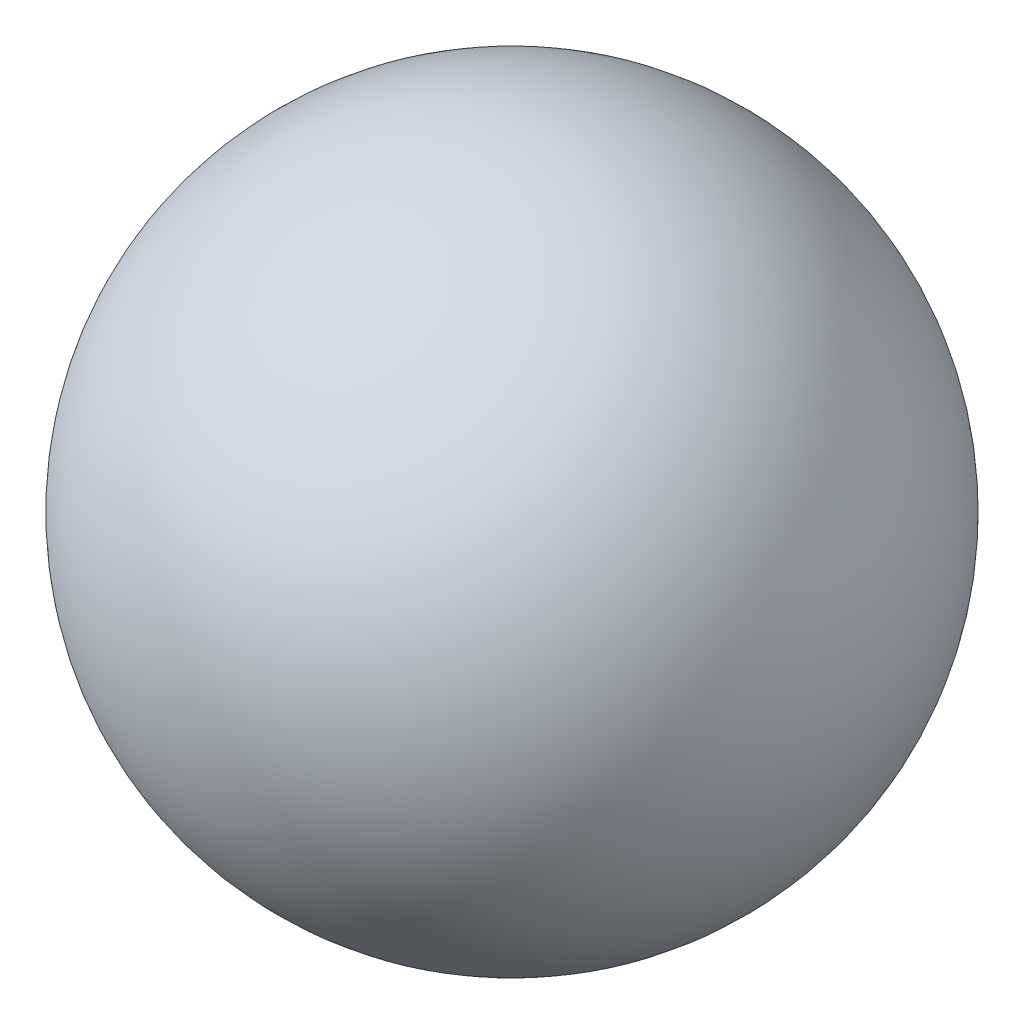
ISO-10303-21;
HEADER;
FILE_DESCRIPTION(('STEP AP214'),'2;1');
FILE_NAME('part.step','',(''),(''),'','','');
FILE_SCHEMA(('AUTOMOTIVE_DESIGN { 1 0 10303 214 1 1 1 1 }'));
ENDSEC;
DATA;
#1=APPLICATION_CONTEXT('core data for automotive mechanical design processes');
#2=APPLICATION_PROTOCOL_DEFINITION('international standard','automotive_design',2000,#1);
#3=PRODUCT_CONTEXT('',#1,'mechanical');
#4=PRODUCT('Part','Part','',(#3));
#5=PRODUCT_RELATED_PRODUCT_CATEGORY('part','',(#4));
#6=PRODUCT_DEFINITION_FORMATION('','',#4);
#7=PRODUCT_DEFINITION_CONTEXT('part definition',#1,'design');
#8=PRODUCT_DEFINITION('design','',#6,#7);
#9=PRODUCT_DEFINITION_SHAPE('','',#8);
#10=(LENGTH_UNIT() NAMED_UNIT(*) SI_UNIT(.MILLI.,.METRE.));
#11=(NAMED_UNIT(*) PLANE_ANGLE_UNIT() SI_UNIT($,.RADIAN.));
#12=(NAMED_UNIT(*) SI_UNIT($,.STERADIAN.) SOLID_ANGLE_UNIT());
#13=UNCERTAINTY_MEASURE_WITH_UNIT(LENGTH_MEASURE(1.E-05),#10,'distance_accuracy_value','');
#14=(GEOMETRIC_REPRESENTATION_CONTEXT(3) GLOBAL_UNCERTAINTY_ASSIGNED_CONTEXT((#13)) GLOBAL_UNIT_ASSIGNED_CONTEXT((#10,
#11,#12)) REPRESENTATION_CONTEXT('',''));
#15=CARTESIAN_POINT('',(0.,0.,0.));
#16=DIRECTION('',(0.,0.,1.));
#17=DIRECTION('',(1.,0.,0.));
#18=AXIS2_PLACEMENT_3D('',#15,#16,#17);
#19=CARTESIAN_POINT('',(0.,0.,0.));
#20=DIRECTION('',(0.,-1.,0.));
#21=DIRECTION('',(-1.,0.,0.));
#22=AXIS2_PLACEMENT_3D('',#19,#20,#21);
#23=SPHERICAL_SURFACE('',#22,65.);
#24=CARTESIAN_POINT('',(0.,-65.,0.));
#25=VERTEX_POINT('',#24);
#26=VERTEX_LOOP('',#25);
#27=FACE_BOUND('',#26,.T.);
#28=ADVANCED_FACE('F39',(#27),#23,.T.);
#29=CLOSED_SHELL('',(#28));
#30=MANIFOLD_SOLID_BREP('B2',#29);
#31=ADVANCED_BREP_SHAPE_REPRESENTATION('',(#18,#30),#14);
#32=SHAPE_DEFINITION_REPRESENTATION(#9,#31);
ENDSEC;
END-ISO-10303-21;
